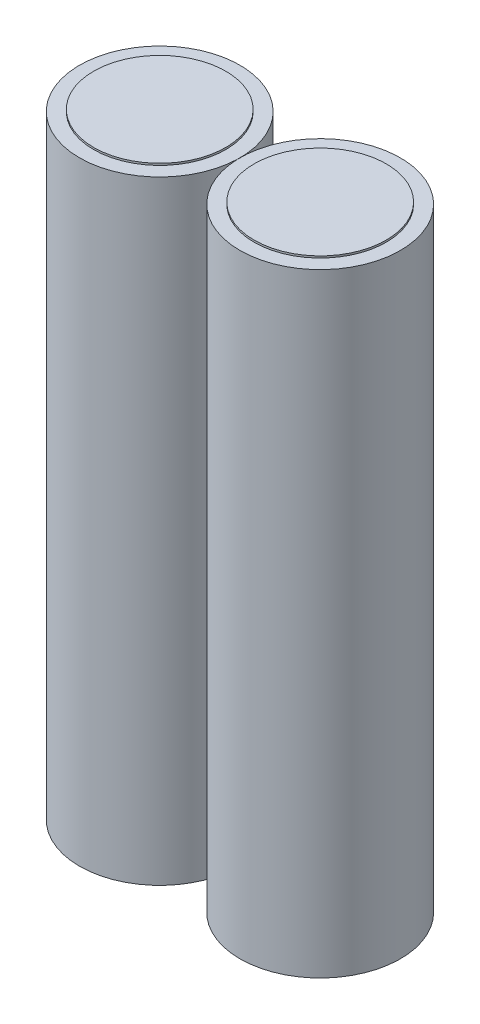
ISO-10303-21;
HEADER;
FILE_DESCRIPTION(('STEP AP214'),'2;1');
FILE_NAME('part.step','',(''),(''),'','','');
FILE_SCHEMA(('AUTOMOTIVE_DESIGN { 1 0 10303 214 1 1 1 1 }'));
ENDSEC;
DATA;
#1=APPLICATION_CONTEXT('core data for automotive mechanical design processes');
#2=APPLICATION_PROTOCOL_DEFINITION('international standard','automotive_design',2000,#1);
#3=PRODUCT_CONTEXT('',#1,'mechanical');
#4=PRODUCT('Part','Part','',(#3));
#5=PRODUCT_RELATED_PRODUCT_CATEGORY('part','',(#4));
#6=PRODUCT_DEFINITION_FORMATION('','',#4);
#7=PRODUCT_DEFINITION_CONTEXT('part definition',#1,'design');
#8=PRODUCT_DEFINITION('design','',#6,#7);
#9=PRODUCT_DEFINITION_SHAPE('','',#8);
#10=(LENGTH_UNIT() NAMED_UNIT(*) SI_UNIT(.MILLI.,.METRE.));
#11=(NAMED_UNIT(*) PLANE_ANGLE_UNIT() SI_UNIT($,.RADIAN.));
#12=(NAMED_UNIT(*) SI_UNIT($,.STERADIAN.) SOLID_ANGLE_UNIT());
#13=UNCERTAINTY_MEASURE_WITH_UNIT(LENGTH_MEASURE(1.E-05),#10,'distance_accuracy_value','');
#14=(GEOMETRIC_REPRESENTATION_CONTEXT(3) GLOBAL_UNCERTAINTY_ASSIGNED_CONTEXT((#13)) GLOBAL_UNIT_ASSIGNED_CONTEXT((#10,
#11,#12)) REPRESENTATION_CONTEXT('',''));
#15=CARTESIAN_POINT('',(0.,0.,0.));
#16=DIRECTION('',(0.,0.,1.));
#17=DIRECTION('',(1.,0.,0.));
#18=AXIS2_PLACEMENT_3D('',#15,#16,#17);
#19=CARTESIAN_POINT('',(0.,65.,0.));
#20=DIRECTION('',(0.,-1.,0.));
#21=DIRECTION('',(0.,0.,-1.));
#22=AXIS2_PLACEMENT_3D('',#19,#20,#21);
#23=CYLINDRICAL_SURFACE('',#22,8.5);
#24=CARTESIAN_POINT('',(0.,65.,0.));
#25=DIRECTION('',(0.,1.,0.));
#26=DIRECTION('',(0.,0.,1.));
#27=AXIS2_PLACEMENT_3D('',#24,#25,#26);
#28=CIRCLE('',#27,8.5);
#29=CARTESIAN_POINT('',(0.,65.,8.5));
#30=VERTEX_POINT('',#29);
#31=EDGE_CURVE('E48',#30,#30,#28,.T.);
#32=ORIENTED_EDGE('',*,*,#31,.F.);
#33=EDGE_LOOP('',(#32));
#34=FACE_BOUND('',#33,.T.);
#35=CARTESIAN_POINT('',(0.,0.,0.));
#36=DIRECTION('',(0.,1.,0.));
#37=DIRECTION('',(0.,0.,1.));
#38=AXIS2_PLACEMENT_3D('',#35,#36,#37);
#39=CIRCLE('',#38,8.5);
#40=CARTESIAN_POINT('',(0.,0.,8.5));
#41=VERTEX_POINT('',#40);
#42=EDGE_CURVE('E52',#41,#41,#39,.T.);
#43=ORIENTED_EDGE('',*,*,#42,.T.);
#44=EDGE_LOOP('',(#43));
#45=FACE_BOUND('',#44,.T.);
#46=ADVANCED_FACE('F42',(#34,#45),#23,.T.);
#47=CARTESIAN_POINT('',(0.,65.,0.));
#48=DIRECTION('',(0.,1.,0.));
#49=DIRECTION('',(0.,0.,1.));
#50=AXIS2_PLACEMENT_3D('',#47,#48,#49);
#51=PLANE('',#50);
#52=CARTESIAN_POINT('',(0.,65.,0.));
#53=DIRECTION('',(0.,1.,0.));
#54=DIRECTION('',(0.,0.,1.));
#55=AXIS2_PLACEMENT_3D('',#52,#53,#54);
#56=CIRCLE('',#55,7.);
#57=CARTESIAN_POINT('',(0.,65.,7.));
#58=VERTEX_POINT('',#57);
#59=EDGE_CURVE('E62',#58,#58,#56,.T.);
#60=ORIENTED_EDGE('',*,*,#59,.F.);
#61=EDGE_LOOP('',(#60));
#62=FACE_BOUND('',#61,.T.);
#63=ORIENTED_EDGE('',*,*,#31,.T.);
#64=EDGE_LOOP('',(#63));
#65=FACE_BOUND('',#64,.T.);
#66=ADVANCED_FACE('F77',(#62,#65),#51,.T.);
#67=CARTESIAN_POINT('',(0.,0.,0.));
#68=DIRECTION('',(0.,1.,0.));
#69=DIRECTION('',(0.,0.,1.));
#70=AXIS2_PLACEMENT_3D('',#67,#68,#69);
#71=PLANE('',#70);
#72=CARTESIAN_POINT('',(0.,0.,0.));
#73=DIRECTION('',(0.,1.,0.));
#74=DIRECTION('',(0.,0.,1.));
#75=AXIS2_PLACEMENT_3D('',#72,#73,#74);
#76=CIRCLE('',#75,5.);
#77=CARTESIAN_POINT('',(0.,0.,5.));
#78=VERTEX_POINT('',#77);
#79=EDGE_CURVE('E11',#78,#78,#76,.F.);
#80=ORIENTED_EDGE('',*,*,#79,.F.);
#81=EDGE_LOOP('',(#80));
#82=FACE_BOUND('',#81,.T.);
#83=ORIENTED_EDGE('',*,*,#42,.F.);
#84=EDGE_LOOP('',(#83));
#85=FACE_BOUND('',#84,.T.);
#86=ADVANCED_FACE('F79',(#82,#85),#71,.F.);
#87=CARTESIAN_POINT('',(0.,-1.,0.));
#88=DIRECTION('',(0.,1.,0.));
#89=DIRECTION('',(0.,0.,1.));
#90=AXIS2_PLACEMENT_3D('',#87,#88,#89);
#91=CYLINDRICAL_SURFACE('',#90,5.);
#92=CARTESIAN_POINT('',(0.,-1.,0.));
#93=DIRECTION('',(0.,-1.,0.));
#94=DIRECTION('',(0.,0.,-1.));
#95=AXIS2_PLACEMENT_3D('',#92,#93,#94);
#96=CIRCLE('',#95,5.);
#97=CARTESIAN_POINT('',(0.,-1.,-5.));
#98=VERTEX_POINT('',#97);
#99=EDGE_CURVE('E57',#98,#98,#96,.T.);
#100=ORIENTED_EDGE('',*,*,#99,.F.);
#101=EDGE_LOOP('',(#100));
#102=FACE_BOUND('',#101,.T.);
#103=ORIENTED_EDGE('',*,*,#79,.T.);
#104=EDGE_LOOP('',(#103));
#105=FACE_BOUND('',#104,.T.);
#106=ADVANCED_FACE('F85',(#102,#105),#91,.T.);
#107=CARTESIAN_POINT('',(0.,-1.,0.));
#108=DIRECTION('',(0.,-1.,0.));
#109=DIRECTION('',(0.,0.,-1.));
#110=AXIS2_PLACEMENT_3D('',#107,#108,#109);
#111=PLANE('',#110);
#112=ORIENTED_EDGE('',*,*,#99,.T.);
#113=EDGE_LOOP('',(#112));
#114=FACE_BOUND('',#113,.T.);
#115=ADVANCED_FACE('F73',(#114),#111,.T.);
#116=CARTESIAN_POINT('',(0.,65.2,0.));
#117=DIRECTION('',(0.,-1.,0.));
#118=DIRECTION('',(0.,0.,-1.));
#119=AXIS2_PLACEMENT_3D('',#116,#117,#118);
#120=CYLINDRICAL_SURFACE('',#119,7.);
#121=CARTESIAN_POINT('',(0.,65.2,0.));
#122=DIRECTION('',(0.,1.,0.));
#123=DIRECTION('',(0.,0.,1.));
#124=AXIS2_PLACEMENT_3D('',#121,#122,#123);
#125=CIRCLE('',#124,7.);
#126=CARTESIAN_POINT('',(0.,65.2,7.));
#127=VERTEX_POINT('',#126);
#128=EDGE_CURVE('E61',#127,#127,#125,.T.);
#129=ORIENTED_EDGE('',*,*,#128,.F.);
#130=EDGE_LOOP('',(#129));
#131=FACE_BOUND('',#130,.T.);
#132=ORIENTED_EDGE('',*,*,#59,.T.);
#133=EDGE_LOOP('',(#132));
#134=FACE_BOUND('',#133,.T.);
#135=ADVANCED_FACE('F70',(#131,#134),#120,.T.);
#136=CARTESIAN_POINT('',(0.,65.2,0.));
#137=DIRECTION('',(0.,1.,0.));
#138=DIRECTION('',(0.,0.,1.));
#139=AXIS2_PLACEMENT_3D('',#136,#137,#138);
#140=PLANE('',#139);
#141=ORIENTED_EDGE('',*,*,#128,.T.);
#142=EDGE_LOOP('',(#141));
#143=FACE_BOUND('',#142,.T.);
#144=ADVANCED_FACE('F68',(#143),#140,.T.);
#145=CLOSED_SHELL('',(#46,#66,#86,#106,#115,#135,#144));
#146=MANIFOLD_SOLID_BREP('B2',#145);
#147=CARTESIAN_POINT('',(17.,65.,0.));
#148=DIRECTION('',(0.,-1.,0.));
#149=DIRECTION('',(0.,0.,-1.));
#150=AXIS2_PLACEMENT_3D('',#147,#148,#149);
#151=CYLINDRICAL_SURFACE('',#150,8.5);
#152=CARTESIAN_POINT('',(17.,0.,0.));
#153=DIRECTION('',(0.,1.,0.));
#154=DIRECTION('',(0.,0.,1.));
#155=AXIS2_PLACEMENT_3D('',#152,#153,#154);
#156=CIRCLE('',#155,8.5);
#157=CARTESIAN_POINT('',(17.,0.,8.5));
#158=VERTEX_POINT('',#157);
#159=EDGE_CURVE('E164',#158,#158,#156,.T.);
#160=ORIENTED_EDGE('',*,*,#159,.T.);
#161=EDGE_LOOP('',(#160));
#162=FACE_BOUND('',#161,.T.);
#163=CARTESIAN_POINT('',(17.,65.,0.));
#164=DIRECTION('',(0.,1.,0.));
#165=DIRECTION('',(0.,0.,1.));
#166=AXIS2_PLACEMENT_3D('',#163,#164,#165);
#167=CIRCLE('',#166,8.5);
#168=CARTESIAN_POINT('',(17.,65.,8.5));
#169=VERTEX_POINT('',#168);
#170=EDGE_CURVE('E160',#169,#169,#167,.T.);
#171=ORIENTED_EDGE('',*,*,#170,.F.);
#172=EDGE_LOOP('',(#171));
#173=FACE_BOUND('',#172,.T.);
#174=ADVANCED_FACE('F154',(#162,#173),#151,.T.);
#175=CARTESIAN_POINT('',(0.,65.,0.));
#176=DIRECTION('',(0.,1.,0.));
#177=DIRECTION('',(0.,0.,1.));
#178=AXIS2_PLACEMENT_3D('',#175,#176,#177);
#179=PLANE('',#178);
#180=CARTESIAN_POINT('',(17.,65.,0.));
#181=DIRECTION('',(0.,1.,0.));
#182=DIRECTION('',(0.,0.,1.));
#183=AXIS2_PLACEMENT_3D('',#180,#181,#182);
#184=CIRCLE('',#183,7.);
#185=CARTESIAN_POINT('',(17.,65.,7.));
#186=VERTEX_POINT('',#185);
#187=EDGE_CURVE('E174',#186,#186,#184,.T.);
#188=ORIENTED_EDGE('',*,*,#187,.F.);
#189=EDGE_LOOP('',(#188));
#190=FACE_BOUND('',#189,.T.);
#191=ORIENTED_EDGE('',*,*,#170,.T.);
#192=EDGE_LOOP('',(#191));
#193=FACE_BOUND('',#192,.T.);
#194=ADVANCED_FACE('F189',(#190,#193),#179,.T.);
#195=CARTESIAN_POINT('',(0.,0.,0.));
#196=DIRECTION('',(0.,1.,0.));
#197=DIRECTION('',(0.,0.,1.));
#198=AXIS2_PLACEMENT_3D('',#195,#196,#197);
#199=PLANE('',#198);
#200=CARTESIAN_POINT('',(17.,0.,0.));
#201=DIRECTION('',(0.,1.,0.));
#202=DIRECTION('',(0.,0.,1.));
#203=AXIS2_PLACEMENT_3D('',#200,#201,#202);
#204=CIRCLE('',#203,5.);
#205=CARTESIAN_POINT('',(17.,0.,5.));
#206=VERTEX_POINT('',#205);
#207=EDGE_CURVE('E41',#206,#206,#204,.F.);
#208=ORIENTED_EDGE('',*,*,#207,.F.);
#209=EDGE_LOOP('',(#208));
#210=FACE_BOUND('',#209,.T.);
#211=ORIENTED_EDGE('',*,*,#159,.F.);
#212=EDGE_LOOP('',(#211));
#213=FACE_BOUND('',#212,.T.);
#214=ADVANCED_FACE('F191',(#210,#213),#199,.F.);
#215=CARTESIAN_POINT('',(17.,-1.,0.));
#216=DIRECTION('',(0.,1.,0.));
#217=DIRECTION('',(0.,0.,1.));
#218=AXIS2_PLACEMENT_3D('',#215,#216,#217);
#219=CYLINDRICAL_SURFACE('',#218,5.);
#220=CARTESIAN_POINT('',(17.,-1.,0.));
#221=DIRECTION('',(0.,-1.,0.));
#222=DIRECTION('',(0.,0.,-1.));
#223=AXIS2_PLACEMENT_3D('',#220,#221,#222);
#224=CIRCLE('',#223,5.);
#225=CARTESIAN_POINT('',(17.,-1.,-5.));
#226=VERTEX_POINT('',#225);
#227=EDGE_CURVE('E169',#226,#226,#224,.T.);
#228=ORIENTED_EDGE('',*,*,#227,.F.);
#229=EDGE_LOOP('',(#228));
#230=FACE_BOUND('',#229,.T.);
#231=ORIENTED_EDGE('',*,*,#207,.T.);
#232=EDGE_LOOP('',(#231));
#233=FACE_BOUND('',#232,.T.);
#234=ADVANCED_FACE('F197',(#230,#233),#219,.T.);
#235=CARTESIAN_POINT('',(17.,-1.,0.));
#236=DIRECTION('',(0.,-1.,0.));
#237=DIRECTION('',(0.,0.,-1.));
#238=AXIS2_PLACEMENT_3D('',#235,#236,#237);
#239=PLANE('',#238);
#240=ORIENTED_EDGE('',*,*,#227,.T.);
#241=EDGE_LOOP('',(#240));
#242=FACE_BOUND('',#241,.T.);
#243=ADVANCED_FACE('F185',(#242),#239,.T.);
#244=CARTESIAN_POINT('',(17.,65.2,0.));
#245=DIRECTION('',(0.,-1.,0.));
#246=DIRECTION('',(0.,0.,-1.));
#247=AXIS2_PLACEMENT_3D('',#244,#245,#246);
#248=CYLINDRICAL_SURFACE('',#247,7.);
#249=CARTESIAN_POINT('',(17.,65.2,0.));
#250=DIRECTION('',(0.,1.,0.));
#251=DIRECTION('',(0.,0.,1.));
#252=AXIS2_PLACEMENT_3D('',#249,#250,#251);
#253=CIRCLE('',#252,7.);
#254=CARTESIAN_POINT('',(17.,65.2,7.));
#255=VERTEX_POINT('',#254);
#256=EDGE_CURVE('E173',#255,#255,#253,.T.);
#257=ORIENTED_EDGE('',*,*,#256,.F.);
#258=EDGE_LOOP('',(#257));
#259=FACE_BOUND('',#258,.T.);
#260=ORIENTED_EDGE('',*,*,#187,.T.);
#261=EDGE_LOOP('',(#260));
#262=FACE_BOUND('',#261,.T.);
#263=ADVANCED_FACE('F182',(#259,#262),#248,.T.);
#264=CARTESIAN_POINT('',(17.,65.2,0.));
#265=DIRECTION('',(0.,1.,0.));
#266=DIRECTION('',(0.,0.,1.));
#267=AXIS2_PLACEMENT_3D('',#264,#265,#266);
#268=PLANE('',#267);
#269=ORIENTED_EDGE('',*,*,#256,.T.);
#270=EDGE_LOOP('',(#269));
#271=FACE_BOUND('',#270,.T.);
#272=ADVANCED_FACE('F180',(#271),#268,.T.);
#273=CLOSED_SHELL('',(#174,#194,#214,#234,#243,#263,#272));
#274=MANIFOLD_SOLID_BREP('B6',#273);
#275=ADVANCED_BREP_SHAPE_REPRESENTATION('',(#18,#146,#274),#14);
#276=SHAPE_DEFINITION_REPRESENTATION(#9,#275);
ENDSEC;
END-ISO-10303-21;
